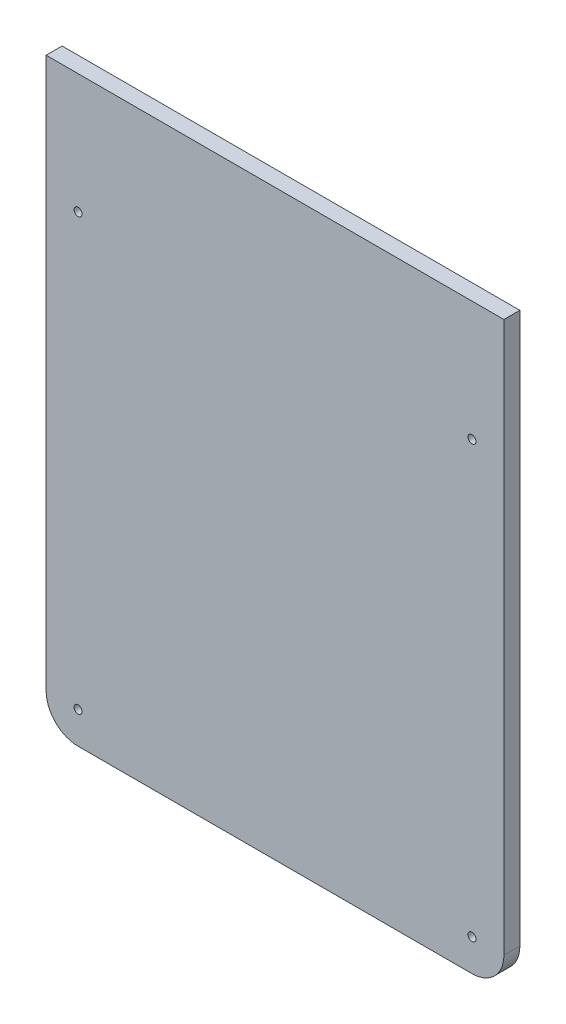
ISO-10303-21;
HEADER;
FILE_DESCRIPTION(('STEP AP214'),'2;1');
FILE_NAME('part.step','',(''),(''),'','','');
FILE_SCHEMA(('AUTOMOTIVE_DESIGN { 1 0 10303 214 1 1 1 1 }'));
ENDSEC;
DATA;
#1=APPLICATION_CONTEXT('core data for automotive mechanical design processes');
#2=APPLICATION_PROTOCOL_DEFINITION('international standard','automotive_design',2000,#1);
#3=PRODUCT_CONTEXT('',#1,'mechanical');
#4=PRODUCT('Part','Part','',(#3));
#5=PRODUCT_RELATED_PRODUCT_CATEGORY('part','',(#4));
#6=PRODUCT_DEFINITION_FORMATION('','',#4);
#7=PRODUCT_DEFINITION_CONTEXT('part definition',#1,'design');
#8=PRODUCT_DEFINITION('design','',#6,#7);
#9=PRODUCT_DEFINITION_SHAPE('','',#8);
#10=(LENGTH_UNIT() NAMED_UNIT(*) SI_UNIT(.MILLI.,.METRE.));
#11=(NAMED_UNIT(*) PLANE_ANGLE_UNIT() SI_UNIT($,.RADIAN.));
#12=(NAMED_UNIT(*) SI_UNIT($,.STERADIAN.) SOLID_ANGLE_UNIT());
#13=UNCERTAINTY_MEASURE_WITH_UNIT(LENGTH_MEASURE(1.E-05),#10,'distance_accuracy_value','');
#14=(GEOMETRIC_REPRESENTATION_CONTEXT(3) GLOBAL_UNCERTAINTY_ASSIGNED_CONTEXT((#13)) GLOBAL_UNIT_ASSIGNED_CONTEXT((#10,
#11,#12)) REPRESENTATION_CONTEXT('',''));
#15=CARTESIAN_POINT('',(0.,0.,0.));
#16=DIRECTION('',(0.,0.,1.));
#17=DIRECTION('',(1.,0.,0.));
#18=AXIS2_PLACEMENT_3D('',#15,#16,#17);
#19=CARTESIAN_POINT('',(163.099999994002,683.952163009712,6.35));
#20=DIRECTION('',(-1.,0.,0.));
#21=DIRECTION('',(0.,-1.,0.));
#22=AXIS2_PLACEMENT_3D('',#19,#20,#21);
#23=PLANE('',#22);
#24=DIRECTION('',(0.,1.,0.));
#25=VECTOR('',#24,1.);
#26=CARTESIAN_POINT('',(163.099999994002,683.952163009712,0.));
#27=LINE('',#26,#25);
#28=CARTESIAN_POINT('',(163.099999994002,683.952163009712,0.));
#29=VERTEX_POINT('',#28);
#30=CARTESIAN_POINT('',(163.099999994006,903.027163009702,0.));
#31=VERTEX_POINT('',#30);
#32=EDGE_CURVE('E119',#29,#31,#27,.T.);
#33=ORIENTED_EDGE('',*,*,#32,.T.);
#34=DIRECTION('',(0.,0.,-1.));
#35=VECTOR('',#34,1.);
#36=CARTESIAN_POINT('',(163.099999994006,903.027163009702,6.35));
#37=LINE('',#36,#35);
#38=CARTESIAN_POINT('',(163.099999994006,903.027163009702,6.35));
#39=VERTEX_POINT('',#38);
#40=EDGE_CURVE('E11',#39,#31,#37,.T.);
#41=ORIENTED_EDGE('',*,*,#40,.F.);
#42=DIRECTION('',(0.,1.,0.));
#43=VECTOR('',#42,1.);
#44=CARTESIAN_POINT('',(163.099999994002,683.952163009712,6.35));
#45=LINE('',#44,#43);
#46=CARTESIAN_POINT('',(163.099999994002,683.952163009712,6.35));
#47=VERTEX_POINT('',#46);
#48=EDGE_CURVE('E130',#47,#39,#45,.T.);
#49=ORIENTED_EDGE('',*,*,#48,.F.);
#50=DIRECTION('',(0.,0.,-1.));
#51=VECTOR('',#50,1.);
#52=CARTESIAN_POINT('',(163.099999994002,683.952163009712,6.35));
#53=LINE('',#52,#51);
#54=EDGE_CURVE('E115',#47,#29,#53,.T.);
#55=ORIENTED_EDGE('',*,*,#54,.T.);
#56=EDGE_LOOP('',(#33,#41,#49,#55));
#57=FACE_BOUND('',#56,.T.);
#58=ADVANCED_FACE('F33',(#57),#23,.F.);
#59=CARTESIAN_POINT('',(-19.0500000000002,903.027163009702,6.35));
#60=DIRECTION('',(0.,-1.,0.));
#61=DIRECTION('',(1.,0.,0.));
#62=AXIS2_PLACEMENT_3D('',#59,#60,#61);
#63=PLANE('',#62);
#64=DIRECTION('',(-1.,0.,0.));
#65=VECTOR('',#64,1.);
#66=CARTESIAN_POINT('',(-19.0500000000002,903.027163009702,0.));
#67=LINE('',#66,#65);
#68=CARTESIAN_POINT('',(-19.0500000000002,903.027163009702,0.));
#69=VERTEX_POINT('',#68);
#70=EDGE_CURVE('E122',#31,#69,#67,.T.);
#71=ORIENTED_EDGE('',*,*,#70,.T.);
#72=DIRECTION('',(0.,0.,-1.));
#73=VECTOR('',#72,1.);
#74=CARTESIAN_POINT('',(-19.0500000000002,903.027163009702,6.35));
#75=LINE('',#74,#73);
#76=CARTESIAN_POINT('',(-19.0500000000002,903.027163009702,6.35));
#77=VERTEX_POINT('',#76);
#78=EDGE_CURVE('E42',#77,#69,#75,.T.);
#79=ORIENTED_EDGE('',*,*,#78,.F.);
#80=DIRECTION('',(-1.,0.,0.));
#81=VECTOR('',#80,1.);
#82=CARTESIAN_POINT('',(-19.0500000000002,903.027163009702,6.35));
#83=LINE('',#82,#81);
#84=EDGE_CURVE('E88',#39,#77,#83,.T.);
#85=ORIENTED_EDGE('',*,*,#84,.F.);
#86=ORIENTED_EDGE('',*,*,#40,.T.);
#87=EDGE_LOOP('',(#71,#79,#85,#86));
#88=FACE_BOUND('',#87,.T.);
#89=ADVANCED_FACE('F163',(#88),#63,.F.);
#90=CARTESIAN_POINT('',(-19.0500000000002,903.027163009702,6.35));
#91=DIRECTION('',(1.,0.,0.));
#92=DIRECTION('',(0.,1.,0.));
#93=AXIS2_PLACEMENT_3D('',#90,#91,#92);
#94=PLANE('',#93);
#95=DIRECTION('',(0.,-1.,0.));
#96=VECTOR('',#95,1.);
#97=CARTESIAN_POINT('',(-19.0500000000002,903.027163009702,0.));
#98=LINE('',#97,#96);
#99=CARTESIAN_POINT('',(-19.0499999999997,683.952163009714,0.));
#100=VERTEX_POINT('',#99);
#101=EDGE_CURVE('E125',#69,#100,#98,.T.);
#102=ORIENTED_EDGE('',*,*,#101,.T.);
#103=DIRECTION('',(0.,0.,-1.));
#104=VECTOR('',#103,1.);
#105=CARTESIAN_POINT('',(-19.0499999999997,683.952163009714,6.35));
#106=LINE('',#105,#104);
#107=CARTESIAN_POINT('',(-19.0499999999997,683.952163009714,6.35));
#108=VERTEX_POINT('',#107);
#109=EDGE_CURVE('E110',#108,#100,#106,.T.);
#110=ORIENTED_EDGE('',*,*,#109,.F.);
#111=DIRECTION('',(0.,-1.,0.));
#112=VECTOR('',#111,1.);
#113=CARTESIAN_POINT('',(-19.0500000000002,903.027163009702,6.35));
#114=LINE('',#113,#112);
#115=EDGE_CURVE('E101',#77,#108,#114,.T.);
#116=ORIENTED_EDGE('',*,*,#115,.F.);
#117=ORIENTED_EDGE('',*,*,#78,.T.);
#118=EDGE_LOOP('',(#102,#110,#116,#117));
#119=FACE_BOUND('',#118,.T.);
#120=ADVANCED_FACE('F166',(#119),#94,.F.);
#121=CARTESIAN_POINT('',(-6.34999999999969,683.952163009714,6.35));
#122=DIRECTION('',(0.,0.,-1.));
#123=DIRECTION('',(-1.,0.,0.));
#124=AXIS2_PLACEMENT_3D('',#121,#122,#123);
#125=CYLINDRICAL_SURFACE('',#124,12.7);
#126=CARTESIAN_POINT('',(-6.34999999999969,683.952163009714,0.));
#127=DIRECTION('',(0.,0.,1.));
#128=DIRECTION('',(1.,0.,0.));
#129=AXIS2_PLACEMENT_3D('',#126,#127,#128);
#130=CIRCLE('',#129,12.7);
#131=CARTESIAN_POINT('',(-6.34999999999988,671.252163009714,0.));
#132=VERTEX_POINT('',#131);
#133=EDGE_CURVE('E109',#100,#132,#130,.T.);
#134=ORIENTED_EDGE('',*,*,#133,.T.);
#135=DIRECTION('',(0.,0.,-1.));
#136=VECTOR('',#135,1.);
#137=CARTESIAN_POINT('',(-6.34999999999988,671.252163009714,6.35));
#138=LINE('',#137,#136);
#139=CARTESIAN_POINT('',(-6.34999999999988,671.252163009714,6.35));
#140=VERTEX_POINT('',#139);
#141=EDGE_CURVE('E106',#140,#132,#138,.T.);
#142=ORIENTED_EDGE('',*,*,#141,.F.);
#143=CARTESIAN_POINT('',(-6.34999999999969,683.952163009714,6.35));
#144=DIRECTION('',(0.,0.,1.));
#145=DIRECTION('',(1.,0.,0.));
#146=AXIS2_PLACEMENT_3D('',#143,#144,#145);
#147=CIRCLE('',#146,12.7);
#148=EDGE_CURVE('E95',#108,#140,#147,.T.);
#149=ORIENTED_EDGE('',*,*,#148,.F.);
#150=ORIENTED_EDGE('',*,*,#109,.T.);
#151=EDGE_LOOP('',(#134,#142,#149,#150));
#152=FACE_BOUND('',#151,.T.);
#153=ADVANCED_FACE('F107',(#152),#125,.T.);
#154=CARTESIAN_POINT('',(-6.34999999999988,671.252163009714,6.35));
#155=DIRECTION('',(0.,1.,0.));
#156=DIRECTION('',(-1.,0.,0.));
#157=AXIS2_PLACEMENT_3D('',#154,#155,#156);
#158=PLANE('',#157);
#159=DIRECTION('',(1.,0.,0.));
#160=VECTOR('',#159,1.);
#161=CARTESIAN_POINT('',(-6.34999999999988,671.252163009714,0.));
#162=LINE('',#161,#160);
#163=CARTESIAN_POINT('',(150.399999994002,671.252163009712,0.));
#164=VERTEX_POINT('',#163);
#165=EDGE_CURVE('E74',#132,#164,#162,.T.);
#166=ORIENTED_EDGE('',*,*,#165,.T.);
#167=DIRECTION('',(0.,0.,-1.));
#168=VECTOR('',#167,1.);
#169=CARTESIAN_POINT('',(150.399999994002,671.252163009712,6.35));
#170=LINE('',#169,#168);
#171=CARTESIAN_POINT('',(150.399999994002,671.252163009712,6.35));
#172=VERTEX_POINT('',#171);
#173=EDGE_CURVE('E111',#172,#164,#170,.T.);
#174=ORIENTED_EDGE('',*,*,#173,.F.);
#175=DIRECTION('',(1.,0.,0.));
#176=VECTOR('',#175,1.);
#177=CARTESIAN_POINT('',(-6.34999999999988,671.252163009714,6.35));
#178=LINE('',#177,#176);
#179=EDGE_CURVE('E99',#140,#172,#178,.T.);
#180=ORIENTED_EDGE('',*,*,#179,.F.);
#181=ORIENTED_EDGE('',*,*,#141,.T.);
#182=EDGE_LOOP('',(#166,#174,#180,#181));
#183=FACE_BOUND('',#182,.T.);
#184=ADVANCED_FACE('F113',(#183),#158,.F.);
#185=CARTESIAN_POINT('',(150.399999994002,683.952163009712,6.35));
#186=DIRECTION('',(0.,0.,-1.));
#187=DIRECTION('',(-1.,0.,0.));
#188=AXIS2_PLACEMENT_3D('',#185,#186,#187);
#189=CYLINDRICAL_SURFACE('',#188,12.7);
#190=CARTESIAN_POINT('',(150.399999994002,683.952163009712,0.));
#191=DIRECTION('',(0.,0.,1.));
#192=DIRECTION('',(1.,0.,0.));
#193=AXIS2_PLACEMENT_3D('',#190,#191,#192);
#194=CIRCLE('',#193,12.7);
#195=EDGE_CURVE('E80',#164,#29,#194,.T.);
#196=ORIENTED_EDGE('',*,*,#195,.T.);
#197=ORIENTED_EDGE('',*,*,#54,.F.);
#198=CARTESIAN_POINT('',(150.399999994002,683.952163009712,6.35));
#199=DIRECTION('',(0.,0.,1.));
#200=DIRECTION('',(1.,0.,0.));
#201=AXIS2_PLACEMENT_3D('',#198,#199,#200);
#202=CIRCLE('',#201,12.7);
#203=EDGE_CURVE('E51',#172,#47,#202,.T.);
#204=ORIENTED_EDGE('',*,*,#203,.F.);
#205=ORIENTED_EDGE('',*,*,#173,.T.);
#206=EDGE_LOOP('',(#196,#197,#204,#205));
#207=FACE_BOUND('',#206,.T.);
#208=ADVANCED_FACE('F171',(#207),#189,.T.);
#209=CARTESIAN_POINT('',(-6.34999999999969,683.952163009714,6.35));
#210=DIRECTION('',(0.,0.,1.));
#211=DIRECTION('',(1.,0.,0.));
#212=AXIS2_PLACEMENT_3D('',#209,#210,#211);
#213=PLANE('',#212);
#214=CARTESIAN_POINT('',(-6.34999999979326,855.402163009699,6.35));
#215=DIRECTION('',(0.,0.,1.));
#216=DIRECTION('',(1.,0.,0.));
#217=AXIS2_PLACEMENT_3D('',#214,#215,#216);
#218=CIRCLE('',#217,1.5875);
#219=CARTESIAN_POINT('',(-4.76249999979325,855.402163009699,6.35));
#220=VERTEX_POINT('',#219);
#221=EDGE_CURVE('E145',#220,#220,#218,.T.);
#222=ORIENTED_EDGE('',*,*,#221,.F.);
#223=EDGE_LOOP('',(#222));
#224=FACE_BOUND('',#223,.T.);
#225=CARTESIAN_POINT('',(-6.34999999979324,683.952163009699,6.35));
#226=DIRECTION('',(0.,0.,1.));
#227=DIRECTION('',(1.,0.,0.));
#228=AXIS2_PLACEMENT_3D('',#225,#226,#227);
#229=CIRCLE('',#228,1.5875);
#230=CARTESIAN_POINT('',(-4.76249999979324,683.952163009699,6.35));
#231=VERTEX_POINT('',#230);
#232=EDGE_CURVE('E142',#231,#231,#229,.T.);
#233=ORIENTED_EDGE('',*,*,#232,.F.);
#234=EDGE_LOOP('',(#233));
#235=FACE_BOUND('',#234,.T.);
#236=CARTESIAN_POINT('',(150.399999994209,683.952163009697,6.35));
#237=DIRECTION('',(0.,0.,1.));
#238=DIRECTION('',(1.,0.,0.));
#239=AXIS2_PLACEMENT_3D('',#236,#237,#238);
#240=CIRCLE('',#239,1.58750000000001);
#241=CARTESIAN_POINT('',(151.987499994209,683.952163009697,6.35));
#242=VERTEX_POINT('',#241);
#243=EDGE_CURVE('E139',#242,#242,#240,.T.);
#244=ORIENTED_EDGE('',*,*,#243,.F.);
#245=EDGE_LOOP('',(#244));
#246=FACE_BOUND('',#245,.T.);
#247=CARTESIAN_POINT('',(150.399999994209,855.402163009697,6.35));
#248=DIRECTION('',(0.,0.,1.));
#249=DIRECTION('',(1.,0.,0.));
#250=AXIS2_PLACEMENT_3D('',#247,#248,#249);
#251=CIRCLE('',#250,1.58750000000001);
#252=CARTESIAN_POINT('',(151.987499994209,855.402163009697,6.35));
#253=VERTEX_POINT('',#252);
#254=EDGE_CURVE('E123',#253,#253,#251,.T.);
#255=ORIENTED_EDGE('',*,*,#254,.F.);
#256=EDGE_LOOP('',(#255));
#257=FACE_BOUND('',#256,.T.);
#258=ORIENTED_EDGE('',*,*,#48,.T.);
#259=ORIENTED_EDGE('',*,*,#84,.T.);
#260=ORIENTED_EDGE('',*,*,#115,.T.);
#261=ORIENTED_EDGE('',*,*,#148,.T.);
#262=ORIENTED_EDGE('',*,*,#179,.T.);
#263=ORIENTED_EDGE('',*,*,#203,.T.);
#264=EDGE_LOOP('',(#258,#259,#260,#261,#262,#263));
#265=FACE_BOUND('',#264,.T.);
#266=ADVANCED_FACE('F97',(#224,#235,#246,#257,#265),#213,.T.);
#267=CARTESIAN_POINT('',(-6.34999999999969,683.952163009714,0.));
#268=DIRECTION('',(0.,0.,1.));
#269=DIRECTION('',(1.,0.,0.));
#270=AXIS2_PLACEMENT_3D('',#267,#268,#269);
#271=PLANE('',#270);
#272=CARTESIAN_POINT('',(-6.34999999979326,855.402163009699,0.));
#273=DIRECTION('',(0.,0.,1.));
#274=DIRECTION('',(1.,0.,0.));
#275=AXIS2_PLACEMENT_3D('',#272,#273,#274);
#276=CIRCLE('',#275,1.5875);
#277=CARTESIAN_POINT('',(-4.76249999979325,855.402163009699,0.));
#278=VERTEX_POINT('',#277);
#279=EDGE_CURVE('E36',#278,#278,#276,.T.);
#280=ORIENTED_EDGE('',*,*,#279,.T.);
#281=EDGE_LOOP('',(#280));
#282=FACE_BOUND('',#281,.T.);
#283=CARTESIAN_POINT('',(-6.34999999979324,683.952163009699,0.));
#284=DIRECTION('',(0.,0.,1.));
#285=DIRECTION('',(1.,0.,0.));
#286=AXIS2_PLACEMENT_3D('',#283,#284,#285);
#287=CIRCLE('',#286,1.5875);
#288=CARTESIAN_POINT('',(-4.76249999979324,683.952163009699,0.));
#289=VERTEX_POINT('',#288);
#290=EDGE_CURVE('E143',#289,#289,#287,.T.);
#291=ORIENTED_EDGE('',*,*,#290,.T.);
#292=EDGE_LOOP('',(#291));
#293=FACE_BOUND('',#292,.T.);
#294=CARTESIAN_POINT('',(150.399999994209,683.952163009697,0.));
#295=DIRECTION('',(0.,0.,1.));
#296=DIRECTION('',(1.,0.,0.));
#297=AXIS2_PLACEMENT_3D('',#294,#295,#296);
#298=CIRCLE('',#297,1.58750000000001);
#299=CARTESIAN_POINT('',(151.987499994209,683.952163009697,0.));
#300=VERTEX_POINT('',#299);
#301=EDGE_CURVE('E140',#300,#300,#298,.T.);
#302=ORIENTED_EDGE('',*,*,#301,.T.);
#303=EDGE_LOOP('',(#302));
#304=FACE_BOUND('',#303,.T.);
#305=CARTESIAN_POINT('',(150.399999994209,855.402163009697,0.));
#306=DIRECTION('',(0.,0.,1.));
#307=DIRECTION('',(1.,0.,0.));
#308=AXIS2_PLACEMENT_3D('',#305,#306,#307);
#309=CIRCLE('',#308,1.58750000000001);
#310=CARTESIAN_POINT('',(151.987499994209,855.402163009697,0.));
#311=VERTEX_POINT('',#310);
#312=EDGE_CURVE('E136',#311,#311,#309,.T.);
#313=ORIENTED_EDGE('',*,*,#312,.T.);
#314=EDGE_LOOP('',(#313));
#315=FACE_BOUND('',#314,.T.);
#316=ORIENTED_EDGE('',*,*,#32,.F.);
#317=ORIENTED_EDGE('',*,*,#195,.F.);
#318=ORIENTED_EDGE('',*,*,#165,.F.);
#319=ORIENTED_EDGE('',*,*,#133,.F.);
#320=ORIENTED_EDGE('',*,*,#101,.F.);
#321=ORIENTED_EDGE('',*,*,#70,.F.);
#322=EDGE_LOOP('',(#316,#317,#318,#319,#320,#321));
#323=FACE_BOUND('',#322,.T.);
#324=ADVANCED_FACE('F169',(#282,#293,#304,#315,#323),#271,.F.);
#325=CARTESIAN_POINT('',(150.399999994209,855.402163009697,19.050000000019));
#326=DIRECTION('',(0.,0.,1.));
#327=DIRECTION('',(1.,0.,0.));
#328=AXIS2_PLACEMENT_3D('',#325,#326,#327);
#329=CYLINDRICAL_SURFACE('',#328,1.58750000000001);
#330=ORIENTED_EDGE('',*,*,#254,.T.);
#331=EDGE_LOOP('',(#330));
#332=FACE_BOUND('',#331,.T.);
#333=ORIENTED_EDGE('',*,*,#312,.F.);
#334=EDGE_LOOP('',(#333));
#335=FACE_BOUND('',#334,.T.);
#336=ADVANCED_FACE('F219',(#332,#335),#329,.F.);
#337=CARTESIAN_POINT('',(150.399999994209,683.952163009697,19.050000000019));
#338=DIRECTION('',(0.,0.,1.));
#339=DIRECTION('',(1.,0.,0.));
#340=AXIS2_PLACEMENT_3D('',#337,#338,#339);
#341=CYLINDRICAL_SURFACE('',#340,1.58750000000001);
#342=ORIENTED_EDGE('',*,*,#243,.T.);
#343=EDGE_LOOP('',(#342));
#344=FACE_BOUND('',#343,.T.);
#345=ORIENTED_EDGE('',*,*,#301,.F.);
#346=EDGE_LOOP('',(#345));
#347=FACE_BOUND('',#346,.T.);
#348=ADVANCED_FACE('F228',(#344,#347),#341,.F.);
#349=CARTESIAN_POINT('',(-6.34999999979324,683.952163009699,19.050000000019));
#350=DIRECTION('',(0.,0.,1.));
#351=DIRECTION('',(1.,0.,0.));
#352=AXIS2_PLACEMENT_3D('',#349,#350,#351);
#353=CYLINDRICAL_SURFACE('',#352,1.5875);
#354=ORIENTED_EDGE('',*,*,#232,.T.);
#355=EDGE_LOOP('',(#354));
#356=FACE_BOUND('',#355,.T.);
#357=ORIENTED_EDGE('',*,*,#290,.F.);
#358=EDGE_LOOP('',(#357));
#359=FACE_BOUND('',#358,.T.);
#360=ADVANCED_FACE('F238',(#356,#359),#353,.F.);
#361=CARTESIAN_POINT('',(-6.34999999979326,855.402163009699,19.050000000019));
#362=DIRECTION('',(0.,0.,1.));
#363=DIRECTION('',(1.,0.,0.));
#364=AXIS2_PLACEMENT_3D('',#361,#362,#363);
#365=CYLINDRICAL_SURFACE('',#364,1.5875);
#366=ORIENTED_EDGE('',*,*,#221,.T.);
#367=EDGE_LOOP('',(#366));
#368=FACE_BOUND('',#367,.T.);
#369=ORIENTED_EDGE('',*,*,#279,.F.);
#370=EDGE_LOOP('',(#369));
#371=FACE_BOUND('',#370,.T.);
#372=ADVANCED_FACE('F248',(#368,#371),#365,.F.);
#373=CLOSED_SHELL('',(#58,#89,#120,#153,#184,#208,#266,#324,#336,#348,#360,#372));
#374=MANIFOLD_SOLID_BREP('B2',#373);
#375=ADVANCED_BREP_SHAPE_REPRESENTATION('',(#18,#374),#14);
#376=SHAPE_DEFINITION_REPRESENTATION(#9,#375);
ENDSEC;
END-ISO-10303-21;
